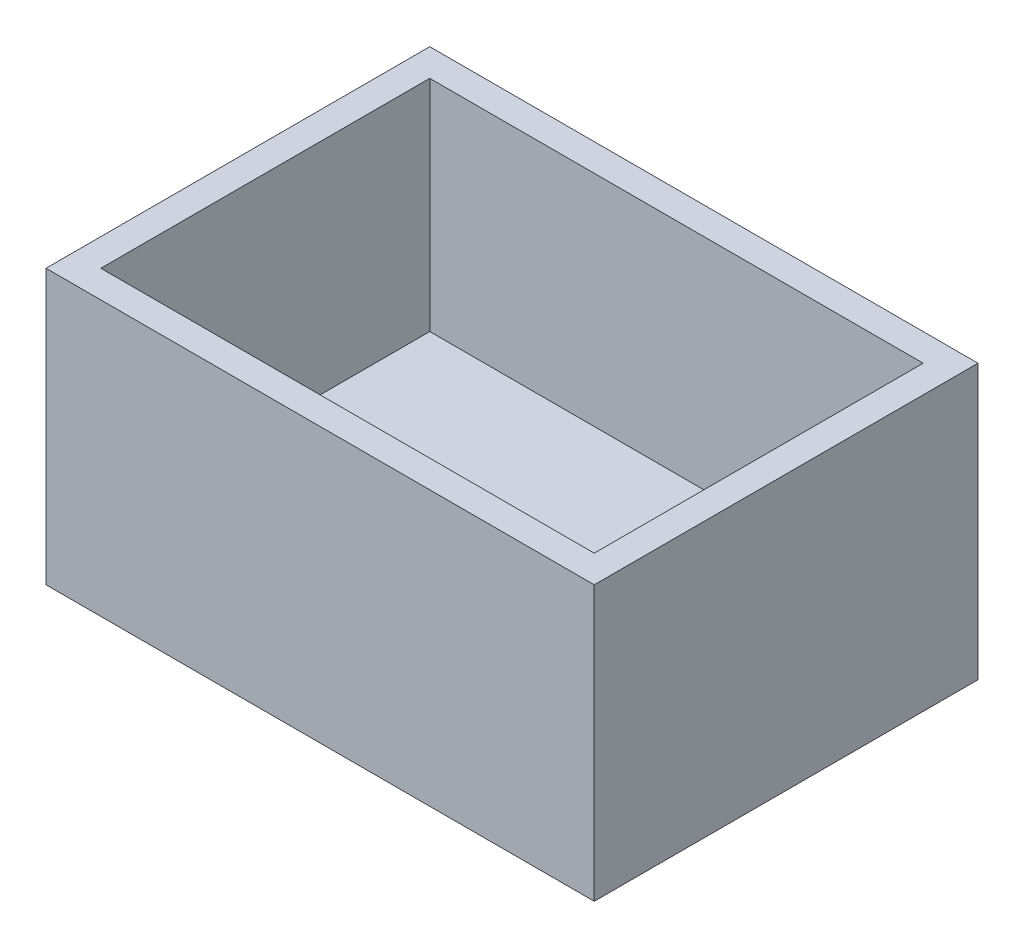
ISO-10303-21;
HEADER;
FILE_DESCRIPTION(('STEP AP214'),'2;1');
FILE_NAME('part.step','',(''),(''),'','','');
FILE_SCHEMA(('AUTOMOTIVE_DESIGN { 1 0 10303 214 1 1 1 1 }'));
ENDSEC;
DATA;
#1=APPLICATION_CONTEXT('core data for automotive mechanical design processes');
#2=APPLICATION_PROTOCOL_DEFINITION('international standard','automotive_design',2000,#1);
#3=PRODUCT_CONTEXT('',#1,'mechanical');
#4=PRODUCT('Part','Part','',(#3));
#5=PRODUCT_RELATED_PRODUCT_CATEGORY('part','',(#4));
#6=PRODUCT_DEFINITION_FORMATION('','',#4);
#7=PRODUCT_DEFINITION_CONTEXT('part definition',#1,'design');
#8=PRODUCT_DEFINITION('design','',#6,#7);
#9=PRODUCT_DEFINITION_SHAPE('','',#8);
#10=(LENGTH_UNIT() NAMED_UNIT(*) SI_UNIT(.MILLI.,.METRE.));
#11=(NAMED_UNIT(*) PLANE_ANGLE_UNIT() SI_UNIT($,.RADIAN.));
#12=(NAMED_UNIT(*) SI_UNIT($,.STERADIAN.) SOLID_ANGLE_UNIT());
#13=UNCERTAINTY_MEASURE_WITH_UNIT(LENGTH_MEASURE(1.E-05),#10,'distance_accuracy_value','');
#14=(GEOMETRIC_REPRESENTATION_CONTEXT(3) GLOBAL_UNCERTAINTY_ASSIGNED_CONTEXT((#13)) GLOBAL_UNIT_ASSIGNED_CONTEXT((#10,
#11,#12)) REPRESENTATION_CONTEXT('',''));
#15=CARTESIAN_POINT('',(0.,0.,0.));
#16=DIRECTION('',(0.,0.,1.));
#17=DIRECTION('',(1.,0.,0.));
#18=AXIS2_PLACEMENT_3D('',#15,#16,#17);
#19=CARTESIAN_POINT('',(127.,127.,88.9));
#20=DIRECTION('',(-1.,0.,0.));
#21=DIRECTION('',(0.,0.,1.));
#22=AXIS2_PLACEMENT_3D('',#19,#20,#21);
#23=PLANE('',#22);
#24=DIRECTION('',(0.,0.,-1.));
#25=VECTOR('',#24,1.);
#26=CARTESIAN_POINT('',(127.,0.,88.9));
#27=LINE('',#26,#25);
#28=CARTESIAN_POINT('',(127.,0.,88.9));
#29=VERTEX_POINT('',#28);
#30=CARTESIAN_POINT('',(127.,0.,-88.9));
#31=VERTEX_POINT('',#30);
#32=EDGE_CURVE('E141',#29,#31,#27,.T.);
#33=ORIENTED_EDGE('',*,*,#32,.T.);
#34=DIRECTION('',(0.,-1.,0.));
#35=VECTOR('',#34,1.);
#36=CARTESIAN_POINT('',(127.,127.,-88.9));
#37=LINE('',#36,#35);
#38=CARTESIAN_POINT('',(127.,127.,-88.9));
#39=VERTEX_POINT('',#38);
#40=EDGE_CURVE('E11',#39,#31,#37,.T.);
#41=ORIENTED_EDGE('',*,*,#40,.F.);
#42=DIRECTION('',(0.,0.,-1.));
#43=VECTOR('',#42,1.);
#44=CARTESIAN_POINT('',(127.,127.,88.9));
#45=LINE('',#44,#43);
#46=CARTESIAN_POINT('',(127.,127.,88.9));
#47=VERTEX_POINT('',#46);
#48=EDGE_CURVE('E145',#47,#39,#45,.T.);
#49=ORIENTED_EDGE('',*,*,#48,.F.);
#50=DIRECTION('',(0.,-1.,0.));
#51=VECTOR('',#50,1.);
#52=CARTESIAN_POINT('',(127.,127.,88.9));
#53=LINE('',#52,#51);
#54=EDGE_CURVE('E151',#47,#29,#53,.T.);
#55=ORIENTED_EDGE('',*,*,#54,.T.);
#56=EDGE_LOOP('',(#33,#41,#49,#55));
#57=FACE_BOUND('',#56,.T.);
#58=ADVANCED_FACE('F33',(#57),#23,.F.);
#59=CARTESIAN_POINT('',(-127.,127.,-88.9));
#60=DIRECTION('',(0.,0.,1.));
#61=DIRECTION('',(1.,0.,0.));
#62=AXIS2_PLACEMENT_3D('',#59,#60,#61);
#63=PLANE('',#62);
#64=DIRECTION('',(-1.,0.,0.));
#65=VECTOR('',#64,1.);
#66=CARTESIAN_POINT('',(-127.,0.,-88.9));
#67=LINE('',#66,#65);
#68=CARTESIAN_POINT('',(-127.,0.,-88.9));
#69=VERTEX_POINT('',#68);
#70=EDGE_CURVE('E154',#31,#69,#67,.T.);
#71=ORIENTED_EDGE('',*,*,#70,.T.);
#72=DIRECTION('',(0.,-1.,0.));
#73=VECTOR('',#72,1.);
#74=CARTESIAN_POINT('',(-127.,127.,-88.9));
#75=LINE('',#74,#73);
#76=CARTESIAN_POINT('',(-127.,127.,-88.9));
#77=VERTEX_POINT('',#76);
#78=EDGE_CURVE('E40',#77,#69,#75,.T.);
#79=ORIENTED_EDGE('',*,*,#78,.F.);
#80=DIRECTION('',(-1.,0.,0.));
#81=VECTOR('',#80,1.);
#82=CARTESIAN_POINT('',(-127.,127.,-88.9));
#83=LINE('',#82,#81);
#84=EDGE_CURVE('E84',#39,#77,#83,.T.);
#85=ORIENTED_EDGE('',*,*,#84,.F.);
#86=ORIENTED_EDGE('',*,*,#40,.T.);
#87=EDGE_LOOP('',(#71,#79,#85,#86));
#88=FACE_BOUND('',#87,.T.);
#89=ADVANCED_FACE('F183',(#88),#63,.F.);
#90=CARTESIAN_POINT('',(-127.,127.,88.9));
#91=DIRECTION('',(1.,0.,0.));
#92=DIRECTION('',(0.,0.,-1.));
#93=AXIS2_PLACEMENT_3D('',#90,#91,#92);
#94=PLANE('',#93);
#95=DIRECTION('',(0.,0.,1.));
#96=VECTOR('',#95,1.);
#97=CARTESIAN_POINT('',(-127.,0.,88.9));
#98=LINE('',#97,#96);
#99=CARTESIAN_POINT('',(-127.,0.,88.9));
#100=VERTEX_POINT('',#99);
#101=EDGE_CURVE('E156',#69,#100,#98,.T.);
#102=ORIENTED_EDGE('',*,*,#101,.T.);
#103=DIRECTION('',(0.,-1.,0.));
#104=VECTOR('',#103,1.);
#105=CARTESIAN_POINT('',(-127.,127.,88.9));
#106=LINE('',#105,#104);
#107=CARTESIAN_POINT('',(-127.,127.,88.9));
#108=VERTEX_POINT('',#107);
#109=EDGE_CURVE('E160',#108,#100,#106,.T.);
#110=ORIENTED_EDGE('',*,*,#109,.F.);
#111=DIRECTION('',(0.,0.,1.));
#112=VECTOR('',#111,1.);
#113=CARTESIAN_POINT('',(-127.,127.,88.9));
#114=LINE('',#113,#112);
#115=EDGE_CURVE('E148',#77,#108,#114,.T.);
#116=ORIENTED_EDGE('',*,*,#115,.F.);
#117=ORIENTED_EDGE('',*,*,#78,.T.);
#118=EDGE_LOOP('',(#102,#110,#116,#117));
#119=FACE_BOUND('',#118,.T.);
#120=ADVANCED_FACE('F165',(#119),#94,.F.);
#121=CARTESIAN_POINT('',(-127.,127.,88.9));
#122=DIRECTION('',(0.,0.,-1.));
#123=DIRECTION('',(-1.,0.,0.));
#124=AXIS2_PLACEMENT_3D('',#121,#122,#123);
#125=PLANE('',#124);
#126=DIRECTION('',(1.,0.,0.));
#127=VECTOR('',#126,1.);
#128=CARTESIAN_POINT('',(-127.,0.,88.9));
#129=LINE('',#128,#127);
#130=EDGE_CURVE('E77',#100,#29,#129,.T.);
#131=ORIENTED_EDGE('',*,*,#130,.T.);
#132=ORIENTED_EDGE('',*,*,#54,.F.);
#133=DIRECTION('',(1.,0.,0.));
#134=VECTOR('',#133,1.);
#135=CARTESIAN_POINT('',(-127.,127.,88.9));
#136=LINE('',#135,#134);
#137=EDGE_CURVE('E56',#108,#47,#136,.T.);
#138=ORIENTED_EDGE('',*,*,#137,.F.);
#139=ORIENTED_EDGE('',*,*,#109,.T.);
#140=EDGE_LOOP('',(#131,#132,#138,#139));
#141=FACE_BOUND('',#140,.T.);
#142=ADVANCED_FACE('F173',(#141),#125,.F.);
#143=CARTESIAN_POINT('',(0.,127.,0.));
#144=DIRECTION('',(0.,-1.,0.));
#145=DIRECTION('',(0.,0.,-1.));
#146=AXIS2_PLACEMENT_3D('',#143,#144,#145);
#147=PLANE('',#146);
#148=DIRECTION('',(-1.,0.,0.));
#149=VECTOR('',#148,1.);
#150=CARTESIAN_POINT('',(-114.3,127.,-76.2));
#151=LINE('',#150,#149);
#152=CARTESIAN_POINT('',(114.3,127.,-76.2));
#153=VERTEX_POINT('',#152);
#154=CARTESIAN_POINT('',(-114.3,127.,-76.2));
#155=VERTEX_POINT('',#154);
#156=EDGE_CURVE('E135',#153,#155,#151,.T.);
#157=ORIENTED_EDGE('',*,*,#156,.F.);
#158=DIRECTION('',(0.,0.,-1.));
#159=VECTOR('',#158,1.);
#160=CARTESIAN_POINT('',(114.3,127.,76.2));
#161=LINE('',#160,#159);
#162=CARTESIAN_POINT('',(114.3,127.,76.2));
#163=VERTEX_POINT('',#162);
#164=EDGE_CURVE('E47',#163,#153,#161,.T.);
#165=ORIENTED_EDGE('',*,*,#164,.F.);
#166=DIRECTION('',(1.,0.,0.));
#167=VECTOR('',#166,1.);
#168=CARTESIAN_POINT('',(-114.3,127.,76.2));
#169=LINE('',#168,#167);
#170=CARTESIAN_POINT('',(-114.3,127.,76.2));
#171=VERTEX_POINT('',#170);
#172=EDGE_CURVE('E126',#171,#163,#169,.T.);
#173=ORIENTED_EDGE('',*,*,#172,.F.);
#174=DIRECTION('',(0.,0.,1.));
#175=VECTOR('',#174,1.);
#176=CARTESIAN_POINT('',(-114.3,127.,76.2));
#177=LINE('',#176,#175);
#178=EDGE_CURVE('E129',#155,#171,#177,.T.);
#179=ORIENTED_EDGE('',*,*,#178,.F.);
#180=EDGE_LOOP('',(#157,#165,#173,#179));
#181=FACE_BOUND('',#180,.T.);
#182=ORIENTED_EDGE('',*,*,#48,.T.);
#183=ORIENTED_EDGE('',*,*,#84,.T.);
#184=ORIENTED_EDGE('',*,*,#115,.T.);
#185=ORIENTED_EDGE('',*,*,#137,.T.);
#186=EDGE_LOOP('',(#182,#183,#184,#185));
#187=FACE_BOUND('',#186,.T.);
#188=ADVANCED_FACE('F175',(#181,#187),#147,.F.);
#189=CARTESIAN_POINT('',(0.,0.,0.));
#190=DIRECTION('',(0.,-1.,0.));
#191=DIRECTION('',(0.,0.,-1.));
#192=AXIS2_PLACEMENT_3D('',#189,#190,#191);
#193=PLANE('',#192);
#194=ORIENTED_EDGE('',*,*,#32,.F.);
#195=ORIENTED_EDGE('',*,*,#130,.F.);
#196=ORIENTED_EDGE('',*,*,#101,.F.);
#197=ORIENTED_EDGE('',*,*,#70,.F.);
#198=EDGE_LOOP('',(#194,#195,#196,#197));
#199=FACE_BOUND('',#198,.T.);
#200=ADVANCED_FACE('F169',(#199),#193,.T.);
#201=CARTESIAN_POINT('',(114.3,25.4,76.2));
#202=DIRECTION('',(1.,0.,0.));
#203=DIRECTION('',(0.,0.,-1.));
#204=AXIS2_PLACEMENT_3D('',#201,#202,#203);
#205=PLANE('',#204);
#206=ORIENTED_EDGE('',*,*,#164,.T.);
#207=DIRECTION('',(0.,1.,0.));
#208=VECTOR('',#207,1.);
#209=CARTESIAN_POINT('',(114.3,25.4,-76.2));
#210=LINE('',#209,#208);
#211=CARTESIAN_POINT('',(114.3,25.4,-76.2));
#212=VERTEX_POINT('',#211);
#213=EDGE_CURVE('E104',#212,#153,#210,.T.);
#214=ORIENTED_EDGE('',*,*,#213,.F.);
#215=DIRECTION('',(0.,0.,-1.));
#216=VECTOR('',#215,1.);
#217=CARTESIAN_POINT('',(114.3,25.4,76.2));
#218=LINE('',#217,#216);
#219=CARTESIAN_POINT('',(114.3,25.4,76.2));
#220=VERTEX_POINT('',#219);
#221=EDGE_CURVE('E108',#220,#212,#218,.T.);
#222=ORIENTED_EDGE('',*,*,#221,.F.);
#223=DIRECTION('',(0.,1.,0.));
#224=VECTOR('',#223,1.);
#225=CARTESIAN_POINT('',(114.3,25.4,76.2));
#226=LINE('',#225,#224);
#227=EDGE_CURVE('E139',#220,#163,#226,.T.);
#228=ORIENTED_EDGE('',*,*,#227,.T.);
#229=EDGE_LOOP('',(#206,#214,#222,#228));
#230=FACE_BOUND('',#229,.T.);
#231=ADVANCED_FACE('F106',(#230),#205,.F.);
#232=CARTESIAN_POINT('',(-114.3,25.4,76.2));
#233=DIRECTION('',(0.,0.,1.));
#234=DIRECTION('',(1.,0.,0.));
#235=AXIS2_PLACEMENT_3D('',#232,#233,#234);
#236=PLANE('',#235);
#237=ORIENTED_EDGE('',*,*,#172,.T.);
#238=ORIENTED_EDGE('',*,*,#227,.F.);
#239=DIRECTION('',(1.,0.,0.));
#240=VECTOR('',#239,1.);
#241=CARTESIAN_POINT('',(-114.3,25.4,76.2));
#242=LINE('',#241,#240);
#243=CARTESIAN_POINT('',(-114.3,25.4,76.2));
#244=VERTEX_POINT('',#243);
#245=EDGE_CURVE('E114',#244,#220,#242,.T.);
#246=ORIENTED_EDGE('',*,*,#245,.F.);
#247=DIRECTION('',(0.,1.,0.));
#248=VECTOR('',#247,1.);
#249=CARTESIAN_POINT('',(-114.3,25.4,76.2));
#250=LINE('',#249,#248);
#251=EDGE_CURVE('E142',#244,#171,#250,.T.);
#252=ORIENTED_EDGE('',*,*,#251,.T.);
#253=EDGE_LOOP('',(#237,#238,#246,#252));
#254=FACE_BOUND('',#253,.T.);
#255=ADVANCED_FACE('F222',(#254),#236,.F.);
#256=CARTESIAN_POINT('',(-114.3,25.4,76.2));
#257=DIRECTION('',(-1.,0.,0.));
#258=DIRECTION('',(0.,0.,1.));
#259=AXIS2_PLACEMENT_3D('',#256,#257,#258);
#260=PLANE('',#259);
#261=ORIENTED_EDGE('',*,*,#178,.T.);
#262=ORIENTED_EDGE('',*,*,#251,.F.);
#263=DIRECTION('',(0.,0.,1.));
#264=VECTOR('',#263,1.);
#265=CARTESIAN_POINT('',(-114.3,25.4,76.2));
#266=LINE('',#265,#264);
#267=CARTESIAN_POINT('',(-114.3,25.4,-76.2));
#268=VERTEX_POINT('',#267);
#269=EDGE_CURVE('E122',#268,#244,#266,.T.);
#270=ORIENTED_EDGE('',*,*,#269,.F.);
#271=DIRECTION('',(0.,1.,0.));
#272=VECTOR('',#271,1.);
#273=CARTESIAN_POINT('',(-114.3,25.4,-76.2));
#274=LINE('',#273,#272);
#275=EDGE_CURVE('E113',#268,#155,#274,.T.);
#276=ORIENTED_EDGE('',*,*,#275,.T.);
#277=EDGE_LOOP('',(#261,#262,#270,#276));
#278=FACE_BOUND('',#277,.T.);
#279=ADVANCED_FACE('F231',(#278),#260,.F.);
#280=CARTESIAN_POINT('',(-114.3,25.4,-76.2));
#281=DIRECTION('',(0.,0.,-1.));
#282=DIRECTION('',(-1.,0.,0.));
#283=AXIS2_PLACEMENT_3D('',#280,#281,#282);
#284=PLANE('',#283);
#285=ORIENTED_EDGE('',*,*,#156,.T.);
#286=ORIENTED_EDGE('',*,*,#275,.F.);
#287=DIRECTION('',(-1.,0.,0.));
#288=VECTOR('',#287,1.);
#289=CARTESIAN_POINT('',(-114.3,25.4,-76.2));
#290=LINE('',#289,#288);
#291=EDGE_CURVE('E117',#212,#268,#290,.T.);
#292=ORIENTED_EDGE('',*,*,#291,.F.);
#293=ORIENTED_EDGE('',*,*,#213,.T.);
#294=EDGE_LOOP('',(#285,#286,#292,#293));
#295=FACE_BOUND('',#294,.T.);
#296=ADVANCED_FACE('F118',(#295),#284,.F.);
#297=CARTESIAN_POINT('',(0.,25.4,0.));
#298=DIRECTION('',(0.,-1.,0.));
#299=DIRECTION('',(0.,0.,-1.));
#300=AXIS2_PLACEMENT_3D('',#297,#298,#299);
#301=PLANE('',#300);
#302=ORIENTED_EDGE('',*,*,#221,.T.);
#303=ORIENTED_EDGE('',*,*,#291,.T.);
#304=ORIENTED_EDGE('',*,*,#269,.T.);
#305=ORIENTED_EDGE('',*,*,#245,.T.);
#306=EDGE_LOOP('',(#302,#303,#304,#305));
#307=FACE_BOUND('',#306,.T.);
#308=ADVANCED_FACE('F124',(#307),#301,.F.);
#309=CLOSED_SHELL('',(#58,#89,#120,#142,#188,#200,#231,#255,#279,#296,#308));
#310=MANIFOLD_SOLID_BREP('B2',#309);
#311=ADVANCED_BREP_SHAPE_REPRESENTATION('',(#18,#310),#14);
#312=SHAPE_DEFINITION_REPRESENTATION(#9,#311);
ENDSEC;
END-ISO-10303-21;
